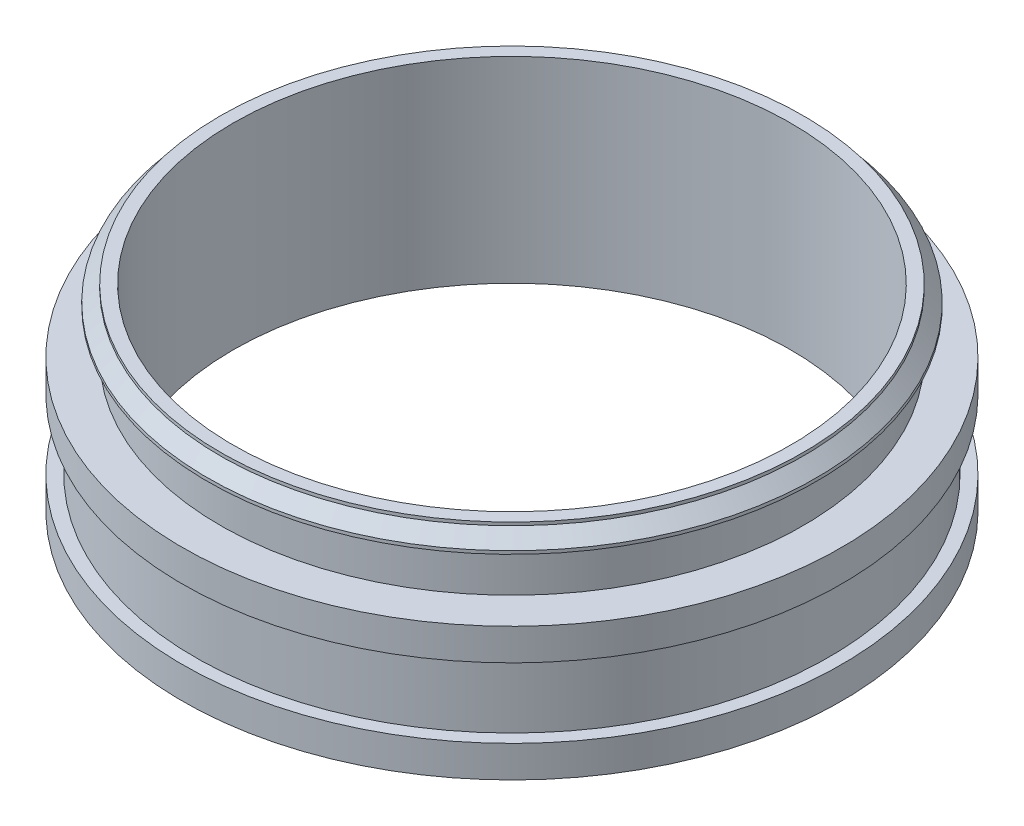
ISO-10303-21;
HEADER;
FILE_DESCRIPTION(('STEP AP214'),'2;1');
FILE_NAME('part.step','',(''),(''),'','','');
FILE_SCHEMA(('AUTOMOTIVE_DESIGN { 1 0 10303 214 1 1 1 1 }'));
ENDSEC;
DATA;
#1=APPLICATION_CONTEXT('core data for automotive mechanical design processes');
#2=APPLICATION_PROTOCOL_DEFINITION('international standard','automotive_design',2000,#1);
#3=PRODUCT_CONTEXT('',#1,'mechanical');
#4=PRODUCT('Part','Part','',(#3));
#5=PRODUCT_RELATED_PRODUCT_CATEGORY('part','',(#4));
#6=PRODUCT_DEFINITION_FORMATION('','',#4);
#7=PRODUCT_DEFINITION_CONTEXT('part definition',#1,'design');
#8=PRODUCT_DEFINITION('design','',#6,#7);
#9=PRODUCT_DEFINITION_SHAPE('','',#8);
#10=(LENGTH_UNIT() NAMED_UNIT(*) SI_UNIT(.MILLI.,.METRE.));
#11=(NAMED_UNIT(*) PLANE_ANGLE_UNIT() SI_UNIT($,.RADIAN.));
#12=(NAMED_UNIT(*) SI_UNIT($,.STERADIAN.) SOLID_ANGLE_UNIT());
#13=UNCERTAINTY_MEASURE_WITH_UNIT(LENGTH_MEASURE(1.E-05),#10,'distance_accuracy_value','');
#14=(GEOMETRIC_REPRESENTATION_CONTEXT(3) GLOBAL_UNCERTAINTY_ASSIGNED_CONTEXT((#13)) GLOBAL_UNIT_ASSIGNED_CONTEXT((#10,
#11,#12)) REPRESENTATION_CONTEXT('',''));
#15=CARTESIAN_POINT('',(0.,0.,0.));
#16=DIRECTION('',(0.,0.,1.));
#17=DIRECTION('',(1.,0.,0.));
#18=AXIS2_PLACEMENT_3D('',#15,#16,#17);
#19=CARTESIAN_POINT('',(48.,11.3811964807991,0.));
#20=DIRECTION('',(0.,-1.,0.));
#21=DIRECTION('',(1.,0.,0.));
#22=AXIS2_PLACEMENT_3D('',#19,#20,#21);
#23=PLANE('',#22);
#24=CARTESIAN_POINT('',(0.,11.3811964807991,0.));
#25=DIRECTION('',(0.,1.,0.));
#26=DIRECTION('',(-1.,0.,0.));
#27=AXIS2_PLACEMENT_3D('',#24,#25,#26);
#28=CIRCLE('',#27,46.);
#29=CARTESIAN_POINT('',(-46.,11.3811964807991,0.));
#30=VERTEX_POINT('',#29);
#31=EDGE_CURVE('E76',#30,#30,#28,.T.);
#32=ORIENTED_EDGE('',*,*,#31,.T.);
#33=EDGE_LOOP('',(#32));
#34=FACE_BOUND('',#33,.T.);
#35=CARTESIAN_POINT('',(0.,11.3811964807991,0.));
#36=DIRECTION('',(0.,1.,0.));
#37=DIRECTION('',(-1.,0.,0.));
#38=AXIS2_PLACEMENT_3D('',#35,#36,#37);
#39=CIRCLE('',#38,48.);
#40=CARTESIAN_POINT('',(-48.,11.3811964807991,0.));
#41=VERTEX_POINT('',#40);
#42=EDGE_CURVE('E10',#41,#41,#39,.T.);
#43=ORIENTED_EDGE('',*,*,#42,.F.);
#44=EDGE_LOOP('',(#43));
#45=FACE_BOUND('',#44,.T.);
#46=ADVANCED_FACE('F30',(#34,#45),#23,.T.);
#47=CARTESIAN_POINT('',(0.,-16.6188035192009,0.));
#48=DIRECTION('',(0.,1.,0.));
#49=DIRECTION('',(-1.,0.,0.));
#50=AXIS2_PLACEMENT_3D('',#47,#48,#49);
#51=CYLINDRICAL_SURFACE('',#50,48.);
#52=ORIENTED_EDGE('',*,*,#42,.T.);
#53=EDGE_LOOP('',(#52));
#54=FACE_BOUND('',#53,.T.);
#55=CARTESIAN_POINT('',(0.,11.8811964807991,0.));
#56=DIRECTION('',(0.,1.,0.));
#57=DIRECTION('',(-1.,0.,0.));
#58=AXIS2_PLACEMENT_3D('',#55,#56,#57);
#59=CIRCLE('',#58,48.);
#60=CARTESIAN_POINT('',(-48.,11.8811964807991,0.));
#61=VERTEX_POINT('',#60);
#62=EDGE_CURVE('E36',#61,#61,#59,.T.);
#63=ORIENTED_EDGE('',*,*,#62,.F.);
#64=EDGE_LOOP('',(#63));
#65=FACE_BOUND('',#64,.T.);
#66=ADVANCED_FACE('F94',(#54,#65),#51,.T.);
#67=CARTESIAN_POINT('',(0.,13.8811964807991,0.));
#68=DIRECTION('',(0.,-1.,0.));
#69=DIRECTION('',(1.,0.,0.));
#70=AXIS2_PLACEMENT_3D('',#67,#68,#69);
#71=CONICAL_SURFACE('',#70,46.,0.785398163397452);
#72=ORIENTED_EDGE('',*,*,#62,.T.);
#73=EDGE_LOOP('',(#72));
#74=FACE_BOUND('',#73,.T.);
#75=CARTESIAN_POINT('',(0.,13.8811964807991,0.));
#76=DIRECTION('',(0.,1.,0.));
#77=DIRECTION('',(-1.,0.,0.));
#78=AXIS2_PLACEMENT_3D('',#75,#76,#77);
#79=CIRCLE('',#78,46.);
#80=CARTESIAN_POINT('',(-46.,13.8811964807991,0.));
#81=VERTEX_POINT('',#80);
#82=EDGE_CURVE('E40',#81,#81,#79,.T.);
#83=ORIENTED_EDGE('',*,*,#82,.F.);
#84=EDGE_LOOP('',(#83));
#85=FACE_BOUND('',#84,.T.);
#86=ADVANCED_FACE('F98',(#74,#85),#71,.T.);
#87=CARTESIAN_POINT('',(0.,-16.6188035192009,0.));
#88=DIRECTION('',(0.,1.,0.));
#89=DIRECTION('',(-1.,0.,0.));
#90=AXIS2_PLACEMENT_3D('',#87,#88,#89);
#91=CYLINDRICAL_SURFACE('',#90,46.);
#92=ORIENTED_EDGE('',*,*,#82,.T.);
#93=EDGE_LOOP('',(#92));
#94=FACE_BOUND('',#93,.T.);
#95=CARTESIAN_POINT('',(0.,14.3811964807991,0.));
#96=DIRECTION('',(0.,1.,0.));
#97=DIRECTION('',(-1.,0.,0.));
#98=AXIS2_PLACEMENT_3D('',#95,#96,#97);
#99=CIRCLE('',#98,46.);
#100=CARTESIAN_POINT('',(-46.,14.3811964807991,0.));
#101=VERTEX_POINT('',#100);
#102=EDGE_CURVE('E44',#101,#101,#99,.T.);
#103=ORIENTED_EDGE('',*,*,#102,.F.);
#104=EDGE_LOOP('',(#103));
#105=FACE_BOUND('',#104,.T.);
#106=ADVANCED_FACE('F102',(#94,#105),#91,.T.);
#107=CARTESIAN_POINT('',(44.,14.3811964807991,0.));
#108=DIRECTION('',(0.,1.,0.));
#109=DIRECTION('',(-1.,0.,0.));
#110=AXIS2_PLACEMENT_3D('',#107,#108,#109);
#111=PLANE('',#110);
#112=ORIENTED_EDGE('',*,*,#102,.T.);
#113=EDGE_LOOP('',(#112));
#114=FACE_BOUND('',#113,.T.);
#115=CARTESIAN_POINT('',(0.,14.3811964807991,0.));
#116=DIRECTION('',(0.,1.,0.));
#117=DIRECTION('',(-1.,0.,0.));
#118=AXIS2_PLACEMENT_3D('',#115,#116,#117);
#119=CIRCLE('',#118,44.);
#120=CARTESIAN_POINT('',(-44.,14.3811964807991,0.));
#121=VERTEX_POINT('',#120);
#122=EDGE_CURVE('E49',#121,#121,#119,.T.);
#123=ORIENTED_EDGE('',*,*,#122,.F.);
#124=EDGE_LOOP('',(#123));
#125=FACE_BOUND('',#124,.T.);
#126=ADVANCED_FACE('F108',(#114,#125),#111,.T.);
#127=CARTESIAN_POINT('',(0.,-16.6188035192009,0.));
#128=DIRECTION('',(0.,1.,0.));
#129=DIRECTION('',(-1.,0.,0.));
#130=AXIS2_PLACEMENT_3D('',#127,#128,#129);
#131=CYLINDRICAL_SURFACE('',#130,44.);
#132=ORIENTED_EDGE('',*,*,#122,.T.);
#133=EDGE_LOOP('',(#132));
#134=FACE_BOUND('',#133,.T.);
#135=CARTESIAN_POINT('',(0.,-16.6188035192009,0.));
#136=DIRECTION('',(0.,1.,0.));
#137=DIRECTION('',(-1.,0.,0.));
#138=AXIS2_PLACEMENT_3D('',#135,#136,#137);
#139=CIRCLE('',#138,44.);
#140=CARTESIAN_POINT('',(-44.,-16.6188035192009,0.));
#141=VERTEX_POINT('',#140);
#142=EDGE_CURVE('E52',#141,#141,#139,.T.);
#143=ORIENTED_EDGE('',*,*,#142,.F.);
#144=EDGE_LOOP('',(#143));
#145=FACE_BOUND('',#144,.T.);
#146=ADVANCED_FACE('F112',(#134,#145),#131,.F.);
#147=CARTESIAN_POINT('',(52.,-16.6188035192009,0.));
#148=DIRECTION('',(0.,-1.,0.));
#149=DIRECTION('',(1.,0.,0.));
#150=AXIS2_PLACEMENT_3D('',#147,#148,#149);
#151=PLANE('',#150);
#152=ORIENTED_EDGE('',*,*,#142,.T.);
#153=EDGE_LOOP('',(#152));
#154=FACE_BOUND('',#153,.T.);
#155=CARTESIAN_POINT('',(0.,-16.6188035192009,0.));
#156=DIRECTION('',(0.,1.,0.));
#157=DIRECTION('',(-1.,0.,0.));
#158=AXIS2_PLACEMENT_3D('',#155,#156,#157);
#159=CIRCLE('',#158,52.);
#160=CARTESIAN_POINT('',(-52.,-16.6188035192009,0.));
#161=VERTEX_POINT('',#160);
#162=EDGE_CURVE('E55',#161,#161,#159,.T.);
#163=ORIENTED_EDGE('',*,*,#162,.F.);
#164=EDGE_LOOP('',(#163));
#165=FACE_BOUND('',#164,.T.);
#166=ADVANCED_FACE('F116',(#154,#165),#151,.T.);
#167=CARTESIAN_POINT('',(0.,-16.6188035192009,0.));
#168=DIRECTION('',(0.,1.,0.));
#169=DIRECTION('',(-1.,0.,0.));
#170=AXIS2_PLACEMENT_3D('',#167,#168,#169);
#171=CYLINDRICAL_SURFACE('',#170,52.);
#172=ORIENTED_EDGE('',*,*,#162,.T.);
#173=EDGE_LOOP('',(#172));
#174=FACE_BOUND('',#173,.T.);
#175=CARTESIAN_POINT('',(0.,-11.6188035192009,0.));
#176=DIRECTION('',(0.,1.,0.));
#177=DIRECTION('',(-1.,0.,0.));
#178=AXIS2_PLACEMENT_3D('',#175,#176,#177);
#179=CIRCLE('',#178,52.);
#180=CARTESIAN_POINT('',(-52.,-11.6188035192009,0.));
#181=VERTEX_POINT('',#180);
#182=EDGE_CURVE('E58',#181,#181,#179,.T.);
#183=ORIENTED_EDGE('',*,*,#182,.F.);
#184=EDGE_LOOP('',(#183));
#185=FACE_BOUND('',#184,.T.);
#186=ADVANCED_FACE('F120',(#174,#185),#171,.T.);
#187=CARTESIAN_POINT('',(50.,-11.6188035192009,0.));
#188=DIRECTION('',(0.,1.,0.));
#189=DIRECTION('',(-1.,0.,0.));
#190=AXIS2_PLACEMENT_3D('',#187,#188,#189);
#191=PLANE('',#190);
#192=ORIENTED_EDGE('',*,*,#182,.T.);
#193=EDGE_LOOP('',(#192));
#194=FACE_BOUND('',#193,.T.);
#195=CARTESIAN_POINT('',(0.,-11.6188035192009,0.));
#196=DIRECTION('',(0.,1.,0.));
#197=DIRECTION('',(-1.,0.,0.));
#198=AXIS2_PLACEMENT_3D('',#195,#196,#197);
#199=CIRCLE('',#198,50.);
#200=CARTESIAN_POINT('',(-50.,-11.6188035192009,0.));
#201=VERTEX_POINT('',#200);
#202=EDGE_CURVE('E61',#201,#201,#199,.T.);
#203=ORIENTED_EDGE('',*,*,#202,.F.);
#204=EDGE_LOOP('',(#203));
#205=FACE_BOUND('',#204,.T.);
#206=ADVANCED_FACE('F124',(#194,#205),#191,.T.);
#207=CARTESIAN_POINT('',(0.,-16.6188035192009,0.));
#208=DIRECTION('',(0.,1.,0.));
#209=DIRECTION('',(-1.,0.,0.));
#210=AXIS2_PLACEMENT_3D('',#207,#208,#209);
#211=CYLINDRICAL_SURFACE('',#210,50.);
#212=ORIENTED_EDGE('',*,*,#202,.T.);
#213=EDGE_LOOP('',(#212));
#214=FACE_BOUND('',#213,.T.);
#215=CARTESIAN_POINT('',(0.,-0.618803519200871,0.));
#216=DIRECTION('',(0.,1.,0.));
#217=DIRECTION('',(-1.,0.,0.));
#218=AXIS2_PLACEMENT_3D('',#215,#216,#217);
#219=CIRCLE('',#218,50.);
#220=CARTESIAN_POINT('',(-50.,-0.618803519200878,0.));
#221=VERTEX_POINT('',#220);
#222=EDGE_CURVE('E64',#221,#221,#219,.T.);
#223=ORIENTED_EDGE('',*,*,#222,.F.);
#224=EDGE_LOOP('',(#223));
#225=FACE_BOUND('',#224,.T.);
#226=ADVANCED_FACE('F128',(#214,#225),#211,.T.);
#227=CARTESIAN_POINT('',(52.,-0.618803519200864,0.));
#228=DIRECTION('',(0.,-1.,0.));
#229=DIRECTION('',(1.,0.,0.));
#230=AXIS2_PLACEMENT_3D('',#227,#228,#229);
#231=PLANE('',#230);
#232=ORIENTED_EDGE('',*,*,#222,.T.);
#233=EDGE_LOOP('',(#232));
#234=FACE_BOUND('',#233,.T.);
#235=CARTESIAN_POINT('',(0.,-0.618803519200871,0.));
#236=DIRECTION('',(0.,1.,0.));
#237=DIRECTION('',(-1.,0.,0.));
#238=AXIS2_PLACEMENT_3D('',#235,#236,#237);
#239=CIRCLE('',#238,52.);
#240=CARTESIAN_POINT('',(-52.,-0.618803519200878,0.));
#241=VERTEX_POINT('',#240);
#242=EDGE_CURVE('E67',#241,#241,#239,.T.);
#243=ORIENTED_EDGE('',*,*,#242,.F.);
#244=EDGE_LOOP('',(#243));
#245=FACE_BOUND('',#244,.T.);
#246=ADVANCED_FACE('F132',(#234,#245),#231,.T.);
#247=CARTESIAN_POINT('',(0.,-16.6188035192009,0.));
#248=DIRECTION('',(0.,1.,0.));
#249=DIRECTION('',(-1.,0.,0.));
#250=AXIS2_PLACEMENT_3D('',#247,#248,#249);
#251=CYLINDRICAL_SURFACE('',#250,52.);
#252=ORIENTED_EDGE('',*,*,#242,.T.);
#253=EDGE_LOOP('',(#252));
#254=FACE_BOUND('',#253,.T.);
#255=CARTESIAN_POINT('',(0.,4.38119648079913,0.));
#256=DIRECTION('',(0.,1.,0.));
#257=DIRECTION('',(-1.,0.,0.));
#258=AXIS2_PLACEMENT_3D('',#255,#256,#257);
#259=CIRCLE('',#258,52.);
#260=CARTESIAN_POINT('',(-52.,4.38119648079912,0.));
#261=VERTEX_POINT('',#260);
#262=EDGE_CURVE('E70',#261,#261,#259,.T.);
#263=ORIENTED_EDGE('',*,*,#262,.F.);
#264=EDGE_LOOP('',(#263));
#265=FACE_BOUND('',#264,.T.);
#266=ADVANCED_FACE('F90',(#254,#265),#251,.T.);
#267=CARTESIAN_POINT('',(46.,4.38119648079913,0.));
#268=DIRECTION('',(0.,1.,0.));
#269=DIRECTION('',(-1.,0.,0.));
#270=AXIS2_PLACEMENT_3D('',#267,#268,#269);
#271=PLANE('',#270);
#272=ORIENTED_EDGE('',*,*,#262,.T.);
#273=EDGE_LOOP('',(#272));
#274=FACE_BOUND('',#273,.T.);
#275=CARTESIAN_POINT('',(0.,4.38119648079913,0.));
#276=DIRECTION('',(0.,1.,0.));
#277=DIRECTION('',(-1.,0.,0.));
#278=AXIS2_PLACEMENT_3D('',#275,#276,#277);
#279=CIRCLE('',#278,46.);
#280=CARTESIAN_POINT('',(-46.,4.38119648079912,0.));
#281=VERTEX_POINT('',#280);
#282=EDGE_CURVE('E73',#281,#281,#279,.T.);
#283=ORIENTED_EDGE('',*,*,#282,.F.);
#284=EDGE_LOOP('',(#283));
#285=FACE_BOUND('',#284,.T.);
#286=ADVANCED_FACE('F84',(#274,#285),#271,.T.);
#287=CARTESIAN_POINT('',(0.,-16.6188035192009,0.));
#288=DIRECTION('',(0.,1.,0.));
#289=DIRECTION('',(-1.,0.,0.));
#290=AXIS2_PLACEMENT_3D('',#287,#288,#289);
#291=CYLINDRICAL_SURFACE('',#290,46.);
#292=ORIENTED_EDGE('',*,*,#282,.T.);
#293=EDGE_LOOP('',(#292));
#294=FACE_BOUND('',#293,.T.);
#295=ORIENTED_EDGE('',*,*,#31,.F.);
#296=EDGE_LOOP('',(#295));
#297=FACE_BOUND('',#296,.T.);
#298=ADVANCED_FACE('F82',(#294,#297),#291,.T.);
#299=CLOSED_SHELL('',(#46,#66,#86,#106,#126,#146,#166,#186,#206,#226,#246,#266,#286,#298));
#300=MANIFOLD_SOLID_BREP('B2',#299);
#301=ADVANCED_BREP_SHAPE_REPRESENTATION('',(#18,#300),#14);
#302=SHAPE_DEFINITION_REPRESENTATION(#9,#301);
ENDSEC;
END-ISO-10303-21;
